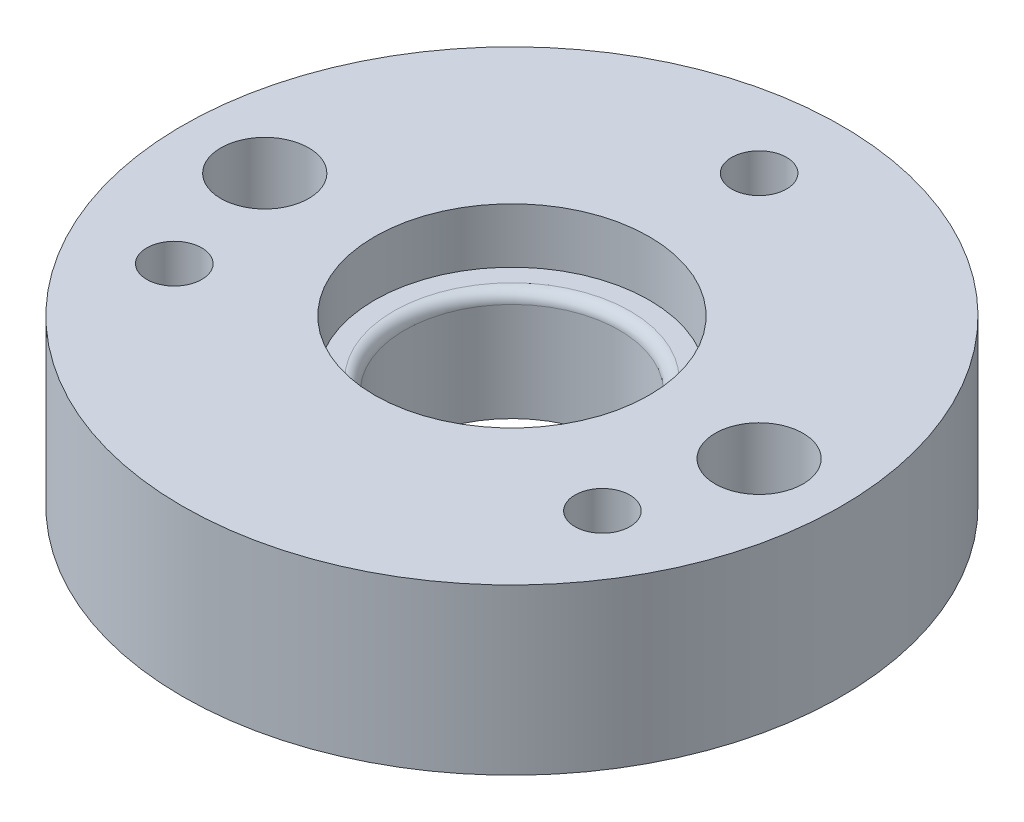
ISO-10303-21;
HEADER;
FILE_DESCRIPTION(('STEP AP214'),'2;1');
FILE_NAME('part.step','',(''),(''),'','','');
FILE_SCHEMA(('AUTOMOTIVE_DESIGN { 1 0 10303 214 1 1 1 1 }'));
ENDSEC;
DATA;
#1=APPLICATION_CONTEXT('core data for automotive mechanical design processes');
#2=APPLICATION_PROTOCOL_DEFINITION('international standard','automotive_design',2000,#1);
#3=PRODUCT_CONTEXT('',#1,'mechanical');
#4=PRODUCT('Part','Part','',(#3));
#5=PRODUCT_RELATED_PRODUCT_CATEGORY('part','',(#4));
#6=PRODUCT_DEFINITION_FORMATION('','',#4);
#7=PRODUCT_DEFINITION_CONTEXT('part definition',#1,'design');
#8=PRODUCT_DEFINITION('design','',#6,#7);
#9=PRODUCT_DEFINITION_SHAPE('','',#8);
#10=(LENGTH_UNIT() NAMED_UNIT(*) SI_UNIT(.MILLI.,.METRE.));
#11=(NAMED_UNIT(*) PLANE_ANGLE_UNIT() SI_UNIT($,.RADIAN.));
#12=(NAMED_UNIT(*) SI_UNIT($,.STERADIAN.) SOLID_ANGLE_UNIT());
#13=UNCERTAINTY_MEASURE_WITH_UNIT(LENGTH_MEASURE(1.E-05),#10,'distance_accuracy_value','');
#14=(GEOMETRIC_REPRESENTATION_CONTEXT(3) GLOBAL_UNCERTAINTY_ASSIGNED_CONTEXT((#13)) GLOBAL_UNIT_ASSIGNED_CONTEXT((#10,
#11,#12)) REPRESENTATION_CONTEXT('',''));
#15=CARTESIAN_POINT('',(0.,0.,0.));
#16=DIRECTION('',(0.,0.,1.));
#17=DIRECTION('',(1.,0.,0.));
#18=AXIS2_PLACEMENT_3D('',#15,#16,#17);
#19=CARTESIAN_POINT('',(0.,-0.000999999999999265,0.));
#20=DIRECTION('',(0.,1.,0.));
#21=DIRECTION('',(0.,0.,1.));
#22=AXIS2_PLACEMENT_3D('',#19,#20,#21);
#23=CYLINDRICAL_SURFACE('',#22,9.765);
#24=CARTESIAN_POINT('',(0.,9.,0.));
#25=DIRECTION('',(0.,1.,0.));
#26=DIRECTION('',(0.,0.,1.));
#27=AXIS2_PLACEMENT_3D('',#24,#25,#26);
#28=CIRCLE('',#27,9.765);
#29=CARTESIAN_POINT('',(0.,9.,9.765));
#30=VERTEX_POINT('',#29);
#31=EDGE_CURVE('E10',#30,#30,#28,.T.);
#32=CARTESIAN_POINT('',(0.,0.,0.));
#33=DIRECTION('',(0.,1.,0.));
#34=DIRECTION('',(0.,0.,1.));
#35=AXIS2_PLACEMENT_3D('',#32,#33,#34);
#36=CIRCLE('',#35,9.765);
#37=CARTESIAN_POINT('',(0.,0.,9.765));
#38=VERTEX_POINT('',#37);
#39=EDGE_CURVE('E102',#38,#38,#36,.F.);
#40=CARTESIAN_POINT('',(0.,9.,9.765));
#41=CARTESIAN_POINT('',(0.,8.90625,9.765));
#42=CARTESIAN_POINT('',(0.,8.8125,9.765));
#43=CARTESIAN_POINT('',(0.,8.625,9.765));
#44=CARTESIAN_POINT('',(0.,8.53125,9.765));
#45=CARTESIAN_POINT('',(0.,8.34375,9.765));
#46=CARTESIAN_POINT('',(0.,8.25,9.765));
#47=CARTESIAN_POINT('',(0.,8.0625,9.765));
#48=CARTESIAN_POINT('',(0.,7.96875,9.765));
#49=CARTESIAN_POINT('',(0.,7.78125,9.765));
#50=CARTESIAN_POINT('',(0.,7.6875,9.765));
#51=CARTESIAN_POINT('',(0.,7.5,9.765));
#52=CARTESIAN_POINT('',(0.,7.40625,9.765));
#53=CARTESIAN_POINT('',(0.,7.21875,9.765));
#54=CARTESIAN_POINT('',(0.,7.125,9.765));
#55=CARTESIAN_POINT('',(0.,6.9375,9.765));
#56=CARTESIAN_POINT('',(0.,6.84375,9.765));
#57=CARTESIAN_POINT('',(0.,6.65625,9.765));
#58=CARTESIAN_POINT('',(0.,6.5625,9.765));
#59=CARTESIAN_POINT('',(0.,6.375,9.765));
#60=CARTESIAN_POINT('',(0.,6.28125,9.765));
#61=CARTESIAN_POINT('',(0.,6.09375,9.765));
#62=CARTESIAN_POINT('',(0.,6.,9.765));
#63=CARTESIAN_POINT('',(0.,5.8125,9.765));
#64=CARTESIAN_POINT('',(0.,5.71875,9.765));
#65=CARTESIAN_POINT('',(0.,5.53125,9.765));
#66=CARTESIAN_POINT('',(0.,5.4375,9.765));
#67=CARTESIAN_POINT('',(0.,5.25,9.765));
#68=CARTESIAN_POINT('',(0.,5.15625,9.765));
#69=CARTESIAN_POINT('',(0.,4.96875,9.765));
#70=CARTESIAN_POINT('',(0.,4.875,9.765));
#71=CARTESIAN_POINT('',(0.,4.6875,9.765));
#72=CARTESIAN_POINT('',(0.,4.59375,9.765));
#73=CARTESIAN_POINT('',(0.,4.40625,9.765));
#74=CARTESIAN_POINT('',(0.,4.3125,9.765));
#75=CARTESIAN_POINT('',(0.,4.125,9.765));
#76=CARTESIAN_POINT('',(0.,4.03125,9.765));
#77=CARTESIAN_POINT('',(0.,3.84375,9.765));
#78=CARTESIAN_POINT('',(0.,3.75,9.765));
#79=CARTESIAN_POINT('',(0.,3.5625,9.765));
#80=CARTESIAN_POINT('',(0.,3.46875,9.765));
#81=CARTESIAN_POINT('',(0.,3.28125,9.765));
#82=CARTESIAN_POINT('',(0.,3.1875,9.765));
#83=CARTESIAN_POINT('',(0.,3.,9.765));
#84=CARTESIAN_POINT('',(0.,2.90625,9.765));
#85=CARTESIAN_POINT('',(0.,2.71875,9.765));
#86=CARTESIAN_POINT('',(0.,2.625,9.765));
#87=CARTESIAN_POINT('',(0.,2.4375,9.765));
#88=CARTESIAN_POINT('',(0.,2.34375,9.765));
#89=CARTESIAN_POINT('',(0.,2.15625,9.765));
#90=CARTESIAN_POINT('',(0.,2.0625,9.765));
#91=CARTESIAN_POINT('',(0.,1.875,9.765));
#92=CARTESIAN_POINT('',(0.,1.78125,9.765));
#93=CARTESIAN_POINT('',(0.,1.59375,9.765));
#94=CARTESIAN_POINT('',(0.,1.5,9.765));
#95=CARTESIAN_POINT('',(0.,1.3125,9.765));
#96=CARTESIAN_POINT('',(0.,1.21875,9.765));
#97=CARTESIAN_POINT('',(0.,1.03125,9.765));
#98=CARTESIAN_POINT('',(0.,0.9375,9.765));
#99=CARTESIAN_POINT('',(0.,0.750000000000001,9.765));
#100=CARTESIAN_POINT('',(0.,0.65625,9.765));
#101=CARTESIAN_POINT('',(0.,0.46875,9.765));
#102=CARTESIAN_POINT('',(0.,0.375,9.765));
#103=CARTESIAN_POINT('',(0.,0.1875,9.765));
#104=CARTESIAN_POINT('',(0.,0.0937500000000002,9.765));
#105=CARTESIAN_POINT('',(0.,0.,9.765));
#106=B_SPLINE_CURVE_WITH_KNOTS('',3,(#40,#41,#42,#43,#44,#45,#46,#47,#48,#49,#50,#51,#52,#53,
#54,#55,#56,#57,#58,#59,#60,#61,#62,#63,#64,#65,#66,#67,#68,#69,#70,#71,#72,#73,#74,#75,#76,#77,
#78,#79,#80,#81,#82,#83,#84,#85,#86,#87,#88,#89,#90,#91,#92,#93,#94,#95,#96,#97,#98,#99,#100,
#101,#102,#103,#104,#105),.UNSPECIFIED.,.F.,.F.,(4,2,2,2,2,2,2,2,2,2,2,2,2,2,2,2,2,2,2,2,2,2,2,
2,2,2,2,2,2,2,2,2,4),(0.,0.28125,0.5625,0.843750000000001,1.125,1.40625,1.6875,1.96875,2.25,
2.53125,2.8125,3.09375,3.375,3.65625,3.9375,4.21875,4.5,4.78125,5.0625,5.34375,5.625,5.90625,
6.1875,6.46875,6.75,7.03125,7.3125,7.59375,7.875,8.15625,8.4375,8.71875,9.),.UNSPECIFIED.);
#107=EDGE_CURVE('BSEAM51',#30,#38,#106,.T.);
#108=ORIENTED_EDGE('',*,*,#31,.T.);
#109=ORIENTED_EDGE('',*,*,#39,.T.);
#110=ORIENTED_EDGE('',*,*,#107,.T.);
#111=ORIENTED_EDGE('',*,*,#107,.F.);
#112=EDGE_LOOP('',(#108,#110,#109,#111));
#113=FACE_BOUND('',#112,.T.);
#114=ADVANCED_FACE('F51',(#113),#23,.F.);
#115=CARTESIAN_POINT('',(0.,15.,0.));
#116=DIRECTION('',(0.,-1.,0.));
#117=DIRECTION('',(0.,0.,-1.));
#118=AXIS2_PLACEMENT_3D('',#115,#116,#117);
#119=CYLINDRICAL_SURFACE('',#118,30.);
#120=CARTESIAN_POINT('',(0.,15.,0.));
#121=DIRECTION('',(0.,1.,0.));
#122=DIRECTION('',(0.,0.,1.));
#123=AXIS2_PLACEMENT_3D('',#120,#121,#122);
#124=CIRCLE('',#123,30.);
#125=CARTESIAN_POINT('',(0.,15.,30.));
#126=VERTEX_POINT('',#125);
#127=EDGE_CURVE('E67',#126,#126,#124,.T.);
#128=ORIENTED_EDGE('',*,*,#127,.F.);
#129=EDGE_LOOP('',(#128));
#130=FACE_BOUND('',#129,.T.);
#131=CARTESIAN_POINT('',(0.,0.,0.));
#132=DIRECTION('',(0.,1.,0.));
#133=DIRECTION('',(0.,0.,1.));
#134=AXIS2_PLACEMENT_3D('',#131,#132,#133);
#135=CIRCLE('',#134,30.);
#136=CARTESIAN_POINT('',(0.,0.,30.));
#137=VERTEX_POINT('',#136);
#138=EDGE_CURVE('E109',#137,#137,#135,.T.);
#139=ORIENTED_EDGE('',*,*,#138,.T.);
#140=EDGE_LOOP('',(#139));
#141=FACE_BOUND('',#140,.T.);
#142=ADVANCED_FACE('F117',(#130,#141),#119,.T.);
#143=CARTESIAN_POINT('',(0.,15.,0.));
#144=DIRECTION('',(0.,1.,0.));
#145=DIRECTION('',(0.,0.,1.));
#146=AXIS2_PLACEMENT_3D('',#143,#144,#145);
#147=PLANE('',#146);
#148=CARTESIAN_POINT('',(22.5,15.,0.));
#149=DIRECTION('',(0.,1.,0.));
#150=DIRECTION('',(0.,0.,1.));
#151=AXIS2_PLACEMENT_3D('',#148,#149,#150);
#152=CIRCLE('',#151,3.99999999999999);
#153=CARTESIAN_POINT('',(22.5,15.,3.99999999999999));
#154=VERTEX_POINT('',#153);
#155=EDGE_CURVE('E172',#154,#154,#152,.T.);
#156=ORIENTED_EDGE('',*,*,#155,.F.);
#157=EDGE_LOOP('',(#156));
#158=FACE_BOUND('',#157,.T.);
#159=CARTESIAN_POINT('',(-22.5,15.,0.));
#160=DIRECTION('',(0.,1.,0.));
#161=DIRECTION('',(0.,0.,1.));
#162=AXIS2_PLACEMENT_3D('',#159,#160,#161);
#163=CIRCLE('',#162,3.99999999999999);
#164=CARTESIAN_POINT('',(-22.5,15.,3.99999999999999));
#165=VERTEX_POINT('',#164);
#166=EDGE_CURVE('E177',#165,#165,#163,.T.);
#167=ORIENTED_EDGE('',*,*,#166,.F.);
#168=EDGE_LOOP('',(#167));
#169=FACE_BOUND('',#168,.T.);
#170=CARTESIAN_POINT('',(0.,15.,-22.5));
#171=DIRECTION('',(0.,1.,0.));
#172=DIRECTION('',(0.,0.,1.));
#173=AXIS2_PLACEMENT_3D('',#170,#171,#172);
#174=CIRCLE('',#173,2.49999999999999);
#175=CARTESIAN_POINT('',(0.,15.,-20.));
#176=VERTEX_POINT('',#175);
#177=EDGE_CURVE('E94',#176,#176,#174,.T.);
#178=ORIENTED_EDGE('',*,*,#177,.F.);
#179=EDGE_LOOP('',(#178));
#180=FACE_BOUND('',#179,.T.);
#181=CARTESIAN_POINT('',(19.4855715851498,15.,11.2500000000001));
#182=DIRECTION('',(0.,1.,0.));
#183=DIRECTION('',(0.,0.,1.));
#184=AXIS2_PLACEMENT_3D('',#181,#182,#183);
#185=CIRCLE('',#184,2.49999999999999);
#186=CARTESIAN_POINT('',(19.4855715851498,15.,13.7500000000001));
#187=VERTEX_POINT('',#186);
#188=EDGE_CURVE('E79',#187,#187,#185,.T.);
#189=ORIENTED_EDGE('',*,*,#188,.F.);
#190=EDGE_LOOP('',(#189));
#191=FACE_BOUND('',#190,.T.);
#192=CARTESIAN_POINT('',(-19.48557158515,15.,11.2499999999998));
#193=DIRECTION('',(0.,1.,0.));
#194=DIRECTION('',(0.,0.,1.));
#195=AXIS2_PLACEMENT_3D('',#192,#193,#194);
#196=CIRCLE('',#195,2.49999999999999);
#197=CARTESIAN_POINT('',(-19.48557158515,15.,13.7499999999998));
#198=VERTEX_POINT('',#197);
#199=EDGE_CURVE('E75',#198,#198,#196,.T.);
#200=ORIENTED_EDGE('',*,*,#199,.F.);
#201=EDGE_LOOP('',(#200));
#202=FACE_BOUND('',#201,.T.);
#203=CARTESIAN_POINT('',(0.,15.,0.));
#204=DIRECTION('',(0.,1.,0.));
#205=DIRECTION('',(0.,0.,1.));
#206=AXIS2_PLACEMENT_3D('',#203,#204,#205);
#207=CIRCLE('',#206,12.5);
#208=CARTESIAN_POINT('',(0.,15.,12.5));
#209=VERTEX_POINT('',#208);
#210=EDGE_CURVE('E74',#209,#209,#207,.T.);
#211=ORIENTED_EDGE('',*,*,#210,.F.);
#212=EDGE_LOOP('',(#211));
#213=FACE_BOUND('',#212,.T.);
#214=ORIENTED_EDGE('',*,*,#127,.T.);
#215=EDGE_LOOP('',(#214));
#216=FACE_BOUND('',#215,.T.);
#217=ADVANCED_FACE('F122',(#158,#169,#180,#191,#202,#213,#216),#147,.T.);
#218=CARTESIAN_POINT('',(0.,0.,0.));
#219=DIRECTION('',(0.,1.,0.));
#220=DIRECTION('',(0.,0.,1.));
#221=AXIS2_PLACEMENT_3D('',#218,#219,#220);
#222=PLANE('',#221);
#223=CARTESIAN_POINT('',(22.5,0.,0.));
#224=DIRECTION('',(0.,1.,0.));
#225=DIRECTION('',(0.,0.,1.));
#226=AXIS2_PLACEMENT_3D('',#223,#224,#225);
#227=CIRCLE('',#226,4.);
#228=CARTESIAN_POINT('',(22.5,0.,4.));
#229=VERTEX_POINT('',#228);
#230=EDGE_CURVE('E169',#229,#229,#227,.T.);
#231=ORIENTED_EDGE('',*,*,#230,.T.);
#232=EDGE_LOOP('',(#231));
#233=FACE_BOUND('',#232,.T.);
#234=CARTESIAN_POINT('',(-22.5,0.,0.));
#235=DIRECTION('',(0.,1.,0.));
#236=DIRECTION('',(0.,0.,1.));
#237=AXIS2_PLACEMENT_3D('',#234,#235,#236);
#238=CIRCLE('',#237,4.);
#239=CARTESIAN_POINT('',(-22.5,0.,4.));
#240=VERTEX_POINT('',#239);
#241=EDGE_CURVE('E182',#240,#240,#238,.T.);
#242=ORIENTED_EDGE('',*,*,#241,.T.);
#243=EDGE_LOOP('',(#242));
#244=FACE_BOUND('',#243,.T.);
#245=CARTESIAN_POINT('',(0.,0.,-22.5));
#246=DIRECTION('',(0.,1.,0.));
#247=DIRECTION('',(0.,0.,1.));
#248=AXIS2_PLACEMENT_3D('',#245,#246,#247);
#249=CIRCLE('',#248,2.49999999999999);
#250=CARTESIAN_POINT('',(0.,0.,-20.));
#251=VERTEX_POINT('',#250);
#252=EDGE_CURVE('E55',#251,#251,#249,.T.);
#253=ORIENTED_EDGE('',*,*,#252,.T.);
#254=EDGE_LOOP('',(#253));
#255=FACE_BOUND('',#254,.T.);
#256=CARTESIAN_POINT('',(19.4855715851498,0.,11.2500000000001));
#257=DIRECTION('',(0.,1.,0.));
#258=DIRECTION('',(0.,0.,1.));
#259=AXIS2_PLACEMENT_3D('',#256,#257,#258);
#260=CIRCLE('',#259,2.49999999999999);
#261=CARTESIAN_POINT('',(19.4855715851498,0.,13.7500000000001));
#262=VERTEX_POINT('',#261);
#263=EDGE_CURVE('E76',#262,#262,#260,.T.);
#264=ORIENTED_EDGE('',*,*,#263,.T.);
#265=EDGE_LOOP('',(#264));
#266=FACE_BOUND('',#265,.T.);
#267=CARTESIAN_POINT('',(-19.48557158515,0.,11.2499999999998));
#268=DIRECTION('',(0.,1.,0.));
#269=DIRECTION('',(0.,0.,1.));
#270=AXIS2_PLACEMENT_3D('',#267,#268,#269);
#271=CIRCLE('',#270,2.49999999999999);
#272=CARTESIAN_POINT('',(-19.48557158515,0.,13.7499999999998));
#273=VERTEX_POINT('',#272);
#274=EDGE_CURVE('E71',#273,#273,#271,.T.);
#275=ORIENTED_EDGE('',*,*,#274,.T.);
#276=EDGE_LOOP('',(#275));
#277=FACE_BOUND('',#276,.T.);
#278=ORIENTED_EDGE('',*,*,#39,.F.);
#279=EDGE_LOOP('',(#278));
#280=FACE_BOUND('',#279,.T.);
#281=ORIENTED_EDGE('',*,*,#138,.F.);
#282=EDGE_LOOP('',(#281));
#283=FACE_BOUND('',#282,.T.);
#284=ADVANCED_FACE('F119',(#233,#244,#255,#266,#277,#280,#283),#222,.F.);
#285=CARTESIAN_POINT('',(0.,10.,0.));
#286=DIRECTION('',(0.,1.,0.));
#287=DIRECTION('',(0.,0.,1.));
#288=AXIS2_PLACEMENT_3D('',#285,#286,#287);
#289=PLANE('',#288);
#290=CARTESIAN_POINT('',(0.,10.,0.));
#291=DIRECTION('',(0.,1.,0.));
#292=DIRECTION('',(0.,0.,1.));
#293=AXIS2_PLACEMENT_3D('',#290,#291,#292);
#294=CIRCLE('',#293,10.765);
#295=CARTESIAN_POINT('',(0.,10.,10.765));
#296=VERTEX_POINT('',#295);
#297=EDGE_CURVE('E60',#296,#296,#294,.F.);
#298=ORIENTED_EDGE('',*,*,#297,.T.);
#299=EDGE_LOOP('',(#298));
#300=FACE_BOUND('',#299,.T.);
#301=CARTESIAN_POINT('',(0.,10.,0.));
#302=DIRECTION('',(0.,1.,0.));
#303=DIRECTION('',(0.,0.,1.));
#304=AXIS2_PLACEMENT_3D('',#301,#302,#303);
#305=CIRCLE('',#304,12.5);
#306=CARTESIAN_POINT('',(0.,10.,12.5));
#307=VERTEX_POINT('',#306);
#308=EDGE_CURVE('E98',#307,#307,#305,.T.);
#309=ORIENTED_EDGE('',*,*,#308,.T.);
#310=EDGE_LOOP('',(#309));
#311=FACE_BOUND('',#310,.T.);
#312=ADVANCED_FACE('F121',(#300,#311),#289,.T.);
#313=CARTESIAN_POINT('',(0.,10.,0.));
#314=DIRECTION('',(0.,1.,0.));
#315=DIRECTION('',(0.,0.,1.));
#316=AXIS2_PLACEMENT_3D('',#313,#314,#315);
#317=CYLINDRICAL_SURFACE('',#316,12.5);
#318=ORIENTED_EDGE('',*,*,#308,.F.);
#319=EDGE_LOOP('',(#318));
#320=FACE_BOUND('',#319,.T.);
#321=ORIENTED_EDGE('',*,*,#210,.T.);
#322=EDGE_LOOP('',(#321));
#323=FACE_BOUND('',#322,.T.);
#324=ADVANCED_FACE('F130',(#320,#323),#317,.F.);
#325=CARTESIAN_POINT('',(0.,9.,0.));
#326=DIRECTION('',(0.,1.,0.));
#327=DIRECTION('',(0.,0.,1.));
#328=AXIS2_PLACEMENT_3D('',#325,#326,#327);
#329=TOROIDAL_SURFACE('',#328,10.765,1.);
#330=ORIENTED_EDGE('',*,*,#31,.F.);
#331=EDGE_LOOP('',(#330));
#332=FACE_BOUND('',#331,.T.);
#333=ORIENTED_EDGE('',*,*,#297,.F.);
#334=EDGE_LOOP('',(#333));
#335=FACE_BOUND('',#334,.T.);
#336=ADVANCED_FACE('F53',(#332,#335),#329,.T.);
#337=CARTESIAN_POINT('',(-19.48557158515,15.,11.2499999999998));
#338=DIRECTION('',(0.,1.,0.));
#339=DIRECTION('',(0.,0.,1.));
#340=AXIS2_PLACEMENT_3D('',#337,#338,#339);
#341=CYLINDRICAL_SURFACE('',#340,2.49999999999999);
#342=ORIENTED_EDGE('',*,*,#199,.T.);
#343=EDGE_LOOP('',(#342));
#344=FACE_BOUND('',#343,.T.);
#345=ORIENTED_EDGE('',*,*,#274,.F.);
#346=EDGE_LOOP('',(#345));
#347=FACE_BOUND('',#346,.T.);
#348=ADVANCED_FACE('F148',(#344,#347),#341,.F.);
#349=CARTESIAN_POINT('',(19.4855715851498,15.,11.2500000000001));
#350=DIRECTION('',(0.,1.,0.));
#351=DIRECTION('',(0.,0.,1.));
#352=AXIS2_PLACEMENT_3D('',#349,#350,#351);
#353=CYLINDRICAL_SURFACE('',#352,2.49999999999999);
#354=ORIENTED_EDGE('',*,*,#188,.T.);
#355=EDGE_LOOP('',(#354));
#356=FACE_BOUND('',#355,.T.);
#357=ORIENTED_EDGE('',*,*,#263,.F.);
#358=EDGE_LOOP('',(#357));
#359=FACE_BOUND('',#358,.T.);
#360=ADVANCED_FACE('F151',(#356,#359),#353,.F.);
#361=CARTESIAN_POINT('',(0.,15.,-22.5));
#362=DIRECTION('',(0.,1.,0.));
#363=DIRECTION('',(0.,0.,1.));
#364=AXIS2_PLACEMENT_3D('',#361,#362,#363);
#365=CYLINDRICAL_SURFACE('',#364,2.49999999999999);
#366=ORIENTED_EDGE('',*,*,#177,.T.);
#367=EDGE_LOOP('',(#366));
#368=FACE_BOUND('',#367,.T.);
#369=ORIENTED_EDGE('',*,*,#252,.F.);
#370=EDGE_LOOP('',(#369));
#371=FACE_BOUND('',#370,.T.);
#372=ADVANCED_FACE('F155',(#368,#371),#365,.F.);
#373=CARTESIAN_POINT('',(-22.5,15.,0.));
#374=DIRECTION('',(0.,1.,0.));
#375=DIRECTION('',(0.,0.,1.));
#376=AXIS2_PLACEMENT_3D('',#373,#374,#375);
#377=CYLINDRICAL_SURFACE('',#376,3.99999999999999);
#378=ORIENTED_EDGE('',*,*,#241,.F.);
#379=EDGE_LOOP('',(#378));
#380=FACE_BOUND('',#379,.T.);
#381=ORIENTED_EDGE('',*,*,#166,.T.);
#382=EDGE_LOOP('',(#381));
#383=FACE_BOUND('',#382,.T.);
#384=ADVANCED_FACE('F158',(#380,#383),#377,.F.);
#385=CARTESIAN_POINT('',(22.5,15.,0.));
#386=DIRECTION('',(0.,1.,0.));
#387=DIRECTION('',(0.,0.,1.));
#388=AXIS2_PLACEMENT_3D('',#385,#386,#387);
#389=CYLINDRICAL_SURFACE('',#388,3.99999999999999);
#390=ORIENTED_EDGE('',*,*,#230,.F.);
#391=EDGE_LOOP('',(#390));
#392=FACE_BOUND('',#391,.T.);
#393=ORIENTED_EDGE('',*,*,#155,.T.);
#394=EDGE_LOOP('',(#393));
#395=FACE_BOUND('',#394,.T.);
#396=ADVANCED_FACE('F161',(#392,#395),#389,.F.);
#397=CLOSED_SHELL('',(#114,#142,#217,#284,#312,#324,#336,#348,#360,#372,#384,#396));
#398=MANIFOLD_SOLID_BREP('B2',#397);
#399=ADVANCED_BREP_SHAPE_REPRESENTATION('',(#18,#398),#14);
#400=SHAPE_DEFINITION_REPRESENTATION(#9,#399);
ENDSEC;
END-ISO-10303-21;
